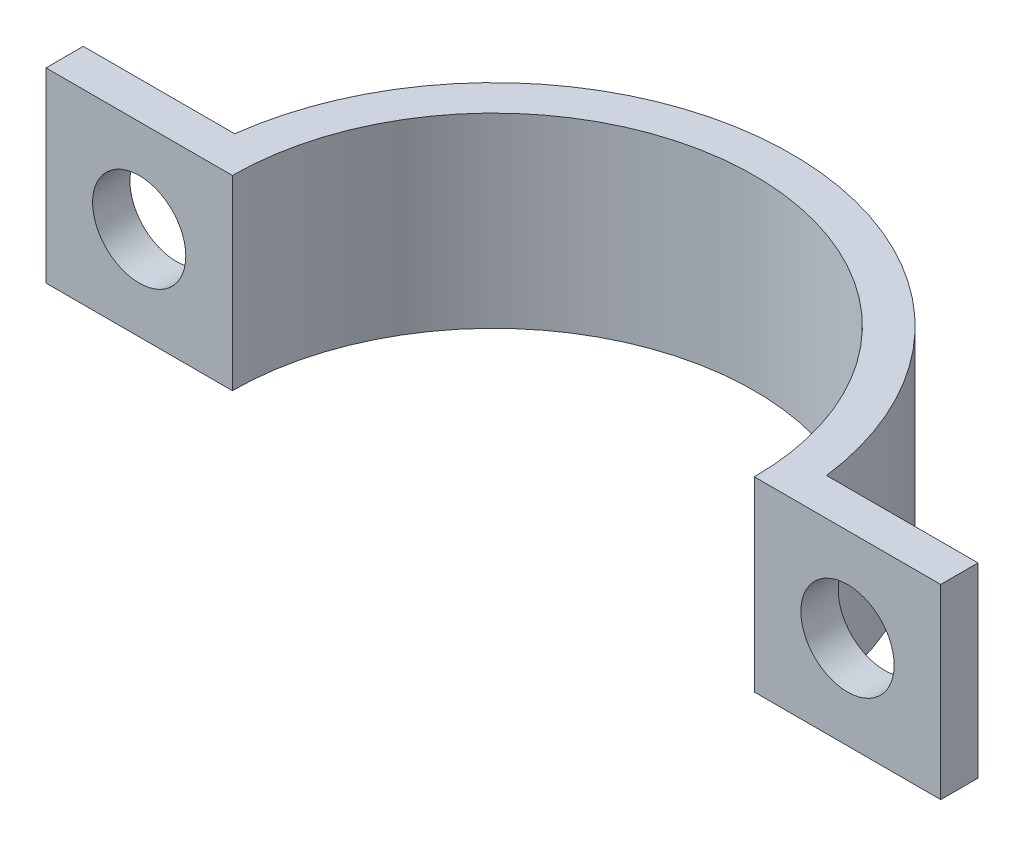
ISO-10303-21;
HEADER;
FILE_DESCRIPTION(('STEP AP214'),'2;1');
FILE_NAME('part.step','',(''),(''),'','','');
FILE_SCHEMA(('AUTOMOTIVE_DESIGN { 1 0 10303 214 1 1 1 1 }'));
ENDSEC;
DATA;
#1=APPLICATION_CONTEXT('core data for automotive mechanical design processes');
#2=APPLICATION_PROTOCOL_DEFINITION('international standard','automotive_design',2000,#1);
#3=PRODUCT_CONTEXT('',#1,'mechanical');
#4=PRODUCT('Part','Part','',(#3));
#5=PRODUCT_RELATED_PRODUCT_CATEGORY('part','',(#4));
#6=PRODUCT_DEFINITION_FORMATION('','',#4);
#7=PRODUCT_DEFINITION_CONTEXT('part definition',#1,'design');
#8=PRODUCT_DEFINITION('design','',#6,#7);
#9=PRODUCT_DEFINITION_SHAPE('','',#8);
#10=(LENGTH_UNIT() NAMED_UNIT(*) SI_UNIT(.MILLI.,.METRE.));
#11=(NAMED_UNIT(*) PLANE_ANGLE_UNIT() SI_UNIT($,.RADIAN.));
#12=(NAMED_UNIT(*) SI_UNIT($,.STERADIAN.) SOLID_ANGLE_UNIT());
#13=UNCERTAINTY_MEASURE_WITH_UNIT(LENGTH_MEASURE(1.E-05),#10,'distance_accuracy_value','');
#14=(GEOMETRIC_REPRESENTATION_CONTEXT(3) GLOBAL_UNCERTAINTY_ASSIGNED_CONTEXT((#13)) GLOBAL_UNIT_ASSIGNED_CONTEXT((#10,
#11,#12)) REPRESENTATION_CONTEXT('',''));
#15=CARTESIAN_POINT('',(0.,0.,0.));
#16=DIRECTION('',(0.,0.,1.));
#17=DIRECTION('',(1.,0.,0.));
#18=AXIS2_PLACEMENT_3D('',#15,#16,#17);
#19=CARTESIAN_POINT('',(14.,10.,0.));
#20=DIRECTION('',(0.,0.,-1.));
#21=DIRECTION('',(-1.,0.,0.));
#22=AXIS2_PLACEMENT_3D('',#19,#20,#21);
#23=PLANE('',#22);
#24=DIRECTION('',(1.,0.,0.));
#25=VECTOR('',#24,1.);
#26=CARTESIAN_POINT('',(14.,0.,0.));
#27=LINE('',#26,#25);
#28=CARTESIAN_POINT('',(14.,0.,0.));
#29=VERTEX_POINT('',#28);
#30=CARTESIAN_POINT('',(24.,0.,0.));
#31=VERTEX_POINT('',#30);
#32=EDGE_CURVE('E136',#29,#31,#27,.T.);
#33=ORIENTED_EDGE('',*,*,#32,.T.);
#34=DIRECTION('',(0.,-1.,0.));
#35=VECTOR('',#34,1.);
#36=CARTESIAN_POINT('',(24.,10.,0.));
#37=LINE('',#36,#35);
#38=CARTESIAN_POINT('',(24.,10.,0.));
#39=VERTEX_POINT('',#38);
#40=EDGE_CURVE('E45',#39,#31,#37,.T.);
#41=ORIENTED_EDGE('',*,*,#40,.F.);
#42=DIRECTION('',(1.,0.,0.));
#43=VECTOR('',#42,1.);
#44=CARTESIAN_POINT('',(14.,10.,0.));
#45=LINE('',#44,#43);
#46=CARTESIAN_POINT('',(14.,10.,0.));
#47=VERTEX_POINT('',#46);
#48=EDGE_CURVE('E96',#47,#39,#45,.T.);
#49=ORIENTED_EDGE('',*,*,#48,.F.);
#50=DIRECTION('',(0.,-1.,0.));
#51=VECTOR('',#50,1.);
#52=CARTESIAN_POINT('',(14.,10.,0.));
#53=LINE('',#52,#51);
#54=EDGE_CURVE('E11',#47,#29,#53,.T.);
#55=ORIENTED_EDGE('',*,*,#54,.T.);
#56=EDGE_LOOP('',(#33,#41,#49,#55));
#57=FACE_BOUND('',#56,.T.);
#58=CARTESIAN_POINT('',(19.,5.,0.));
#59=DIRECTION('',(0.,0.,-1.));
#60=DIRECTION('',(-1.,0.,0.));
#61=AXIS2_PLACEMENT_3D('',#58,#59,#60);
#62=CIRCLE('',#61,2.5);
#63=CARTESIAN_POINT('',(16.5,5.,0.));
#64=VERTEX_POINT('',#63);
#65=EDGE_CURVE('E188',#64,#64,#62,.T.);
#66=ORIENTED_EDGE('',*,*,#65,.T.);
#67=EDGE_LOOP('',(#66));
#68=FACE_BOUND('',#67,.T.);
#69=ADVANCED_FACE('F35',(#57,#68),#23,.F.);
#70=CARTESIAN_POINT('',(15.8745078663875,10.,-2.));
#71=DIRECTION('',(0.,0.,1.));
#72=DIRECTION('',(1.,0.,0.));
#73=AXIS2_PLACEMENT_3D('',#70,#71,#72);
#74=PLANE('',#73);
#75=DIRECTION('',(-1.,0.,0.));
#76=VECTOR('',#75,1.);
#77=CARTESIAN_POINT('',(15.8745078663875,0.,-2.));
#78=LINE('',#77,#76);
#79=CARTESIAN_POINT('',(24.,0.,-2.));
#80=VERTEX_POINT('',#79);
#81=CARTESIAN_POINT('',(15.8745078663875,0.,-2.));
#82=VERTEX_POINT('',#81);
#83=EDGE_CURVE('E141',#80,#82,#78,.T.);
#84=ORIENTED_EDGE('',*,*,#83,.T.);
#85=DIRECTION('',(0.,-1.,0.));
#86=VECTOR('',#85,1.);
#87=CARTESIAN_POINT('',(15.8745078663875,10.,-2.));
#88=LINE('',#87,#86);
#89=CARTESIAN_POINT('',(15.8745078663875,10.,-2.));
#90=VERTEX_POINT('',#89);
#91=EDGE_CURVE('E152',#90,#82,#88,.T.);
#92=ORIENTED_EDGE('',*,*,#91,.F.);
#93=DIRECTION('',(-1.,0.,0.));
#94=VECTOR('',#93,1.);
#95=CARTESIAN_POINT('',(15.8745078663875,10.,-2.));
#96=LINE('',#95,#94);
#97=CARTESIAN_POINT('',(24.,10.,-2.));
#98=VERTEX_POINT('',#97);
#99=EDGE_CURVE('E177',#98,#90,#96,.T.);
#100=ORIENTED_EDGE('',*,*,#99,.F.);
#101=DIRECTION('',(0.,-1.,0.));
#102=VECTOR('',#101,1.);
#103=CARTESIAN_POINT('',(24.,10.,-2.));
#104=LINE('',#103,#102);
#105=EDGE_CURVE('E155',#98,#80,#104,.T.);
#106=ORIENTED_EDGE('',*,*,#105,.T.);
#107=EDGE_LOOP('',(#84,#92,#100,#106));
#108=FACE_BOUND('',#107,.T.);
#109=CARTESIAN_POINT('',(19.,5.,-2.));
#110=DIRECTION('',(0.,0.,1.));
#111=DIRECTION('',(1.,0.,0.));
#112=AXIS2_PLACEMENT_3D('',#109,#110,#111);
#113=CIRCLE('',#112,2.5);
#114=CARTESIAN_POINT('',(21.5,5.,-2.));
#115=VERTEX_POINT('',#114);
#116=EDGE_CURVE('E39',#115,#115,#113,.F.);
#117=ORIENTED_EDGE('',*,*,#116,.F.);
#118=EDGE_LOOP('',(#117));
#119=FACE_BOUND('',#118,.T.);
#120=ADVANCED_FACE('F172',(#108,#119),#74,.F.);
#121=CARTESIAN_POINT('',(0.,10.,0.));
#122=DIRECTION('',(0.,-1.,0.));
#123=DIRECTION('',(0.,0.,-1.));
#124=AXIS2_PLACEMENT_3D('',#121,#122,#123);
#125=CYLINDRICAL_SURFACE('',#124,14.);
#126=CARTESIAN_POINT('',(0.,0.,0.));
#127=DIRECTION('',(0.,-1.,0.));
#128=DIRECTION('',(0.,0.,-1.));
#129=AXIS2_PLACEMENT_3D('',#126,#127,#128);
#130=CIRCLE('',#129,14.);
#131=CARTESIAN_POINT('',(-14.,0.,0.));
#132=VERTEX_POINT('',#131);
#133=EDGE_CURVE('E133',#132,#29,#130,.T.);
#134=ORIENTED_EDGE('',*,*,#133,.T.);
#135=ORIENTED_EDGE('',*,*,#54,.F.);
#136=CARTESIAN_POINT('',(0.,10.,0.));
#137=DIRECTION('',(0.,-1.,0.));
#138=DIRECTION('',(0.,0.,-1.));
#139=AXIS2_PLACEMENT_3D('',#136,#137,#138);
#140=CIRCLE('',#139,14.);
#141=CARTESIAN_POINT('',(-14.,10.,0.));
#142=VERTEX_POINT('',#141);
#143=EDGE_CURVE('E148',#142,#47,#140,.T.);
#144=ORIENTED_EDGE('',*,*,#143,.F.);
#145=DIRECTION('',(0.,-1.,0.));
#146=VECTOR('',#145,1.);
#147=CARTESIAN_POINT('',(-14.,10.,0.));
#148=LINE('',#147,#146);
#149=EDGE_CURVE('E129',#142,#132,#148,.T.);
#150=ORIENTED_EDGE('',*,*,#149,.T.);
#151=EDGE_LOOP('',(#134,#135,#144,#150));
#152=FACE_BOUND('',#151,.T.);
#153=ADVANCED_FACE('F37',(#152),#125,.F.);
#154=CARTESIAN_POINT('',(24.,10.,-2.));
#155=DIRECTION('',(-1.,0.,0.));
#156=DIRECTION('',(0.,0.,1.));
#157=AXIS2_PLACEMENT_3D('',#154,#155,#156);
#158=PLANE('',#157);
#159=DIRECTION('',(0.,0.,-1.));
#160=VECTOR('',#159,1.);
#161=CARTESIAN_POINT('',(24.,0.,-2.));
#162=LINE('',#161,#160);
#163=EDGE_CURVE('E139',#31,#80,#162,.T.);
#164=ORIENTED_EDGE('',*,*,#163,.T.);
#165=ORIENTED_EDGE('',*,*,#105,.F.);
#166=DIRECTION('',(0.,0.,-1.));
#167=VECTOR('',#166,1.);
#168=CARTESIAN_POINT('',(24.,10.,-2.));
#169=LINE('',#168,#167);
#170=EDGE_CURVE('E164',#39,#98,#169,.T.);
#171=ORIENTED_EDGE('',*,*,#170,.F.);
#172=ORIENTED_EDGE('',*,*,#40,.T.);
#173=EDGE_LOOP('',(#164,#165,#171,#172));
#174=FACE_BOUND('',#173,.T.);
#175=ADVANCED_FACE('F162',(#174),#158,.F.);
#176=CARTESIAN_POINT('',(0.,10.,0.));
#177=DIRECTION('',(0.,-1.,0.));
#178=DIRECTION('',(0.,0.,-1.));
#179=AXIS2_PLACEMENT_3D('',#176,#177,#178);
#180=CYLINDRICAL_SURFACE('',#179,16.);
#181=CARTESIAN_POINT('',(0.,0.,0.));
#182=DIRECTION('',(0.,1.,0.));
#183=DIRECTION('',(0.,0.,-1.));
#184=AXIS2_PLACEMENT_3D('',#181,#182,#183);
#185=CIRCLE('',#184,16.);
#186=CARTESIAN_POINT('',(-15.8745078663875,0.,-2.));
#187=VERTEX_POINT('',#186);
#188=EDGE_CURVE('E143',#82,#187,#185,.T.);
#189=ORIENTED_EDGE('',*,*,#188,.T.);
#190=DIRECTION('',(0.,-1.,0.));
#191=VECTOR('',#190,1.);
#192=CARTESIAN_POINT('',(-15.8745078663875,10.,-2.));
#193=LINE('',#192,#191);
#194=CARTESIAN_POINT('',(-15.8745078663875,10.,-2.));
#195=VERTEX_POINT('',#194);
#196=EDGE_CURVE('E124',#195,#187,#193,.T.);
#197=ORIENTED_EDGE('',*,*,#196,.F.);
#198=CARTESIAN_POINT('',(0.,10.,0.));
#199=DIRECTION('',(0.,1.,0.));
#200=DIRECTION('',(0.,0.,-1.));
#201=AXIS2_PLACEMENT_3D('',#198,#199,#200);
#202=CIRCLE('',#201,16.);
#203=EDGE_CURVE('E115',#90,#195,#202,.T.);
#204=ORIENTED_EDGE('',*,*,#203,.F.);
#205=ORIENTED_EDGE('',*,*,#91,.T.);
#206=EDGE_LOOP('',(#189,#197,#204,#205));
#207=FACE_BOUND('',#206,.T.);
#208=ADVANCED_FACE('F176',(#207),#180,.T.);
#209=CARTESIAN_POINT('',(-15.8745078663875,10.,-2.));
#210=DIRECTION('',(0.,0.,1.));
#211=DIRECTION('',(1.,0.,0.));
#212=AXIS2_PLACEMENT_3D('',#209,#210,#211);
#213=PLANE('',#212);
#214=CARTESIAN_POINT('',(-19.,5.,-2.));
#215=DIRECTION('',(0.,0.,1.));
#216=DIRECTION('',(1.,0.,0.));
#217=AXIS2_PLACEMENT_3D('',#214,#215,#216);
#218=CIRCLE('',#217,2.5);
#219=CARTESIAN_POINT('',(-16.5,5.,-2.));
#220=VERTEX_POINT('',#219);
#221=EDGE_CURVE('E137',#220,#220,#218,.T.);
#222=ORIENTED_EDGE('',*,*,#221,.T.);
#223=EDGE_LOOP('',(#222));
#224=FACE_BOUND('',#223,.T.);
#225=DIRECTION('',(-1.,0.,0.));
#226=VECTOR('',#225,1.);
#227=CARTESIAN_POINT('',(-15.8745078663875,0.,-2.));
#228=LINE('',#227,#226);
#229=CARTESIAN_POINT('',(-24.,0.,-2.));
#230=VERTEX_POINT('',#229);
#231=EDGE_CURVE('E123',#187,#230,#228,.T.);
#232=ORIENTED_EDGE('',*,*,#231,.T.);
#233=DIRECTION('',(0.,-1.,0.));
#234=VECTOR('',#233,1.);
#235=CARTESIAN_POINT('',(-24.,10.,-2.));
#236=LINE('',#235,#234);
#237=CARTESIAN_POINT('',(-24.,10.,-2.));
#238=VERTEX_POINT('',#237);
#239=EDGE_CURVE('E120',#238,#230,#236,.T.);
#240=ORIENTED_EDGE('',*,*,#239,.F.);
#241=DIRECTION('',(-1.,0.,0.));
#242=VECTOR('',#241,1.);
#243=CARTESIAN_POINT('',(-15.8745078663875,10.,-2.));
#244=LINE('',#243,#242);
#245=EDGE_CURVE('E109',#195,#238,#244,.T.);
#246=ORIENTED_EDGE('',*,*,#245,.F.);
#247=ORIENTED_EDGE('',*,*,#196,.T.);
#248=EDGE_LOOP('',(#232,#240,#246,#247));
#249=FACE_BOUND('',#248,.T.);
#250=ADVANCED_FACE('F121',(#224,#249),#213,.F.);
#251=CARTESIAN_POINT('',(-24.,10.,-2.));
#252=DIRECTION('',(1.,0.,0.));
#253=DIRECTION('',(0.,0.,-1.));
#254=AXIS2_PLACEMENT_3D('',#251,#252,#253);
#255=PLANE('',#254);
#256=DIRECTION('',(0.,0.,1.));
#257=VECTOR('',#256,1.);
#258=CARTESIAN_POINT('',(-24.,0.,-2.));
#259=LINE('',#258,#257);
#260=CARTESIAN_POINT('',(-24.,0.,0.));
#261=VERTEX_POINT('',#260);
#262=EDGE_CURVE('E82',#230,#261,#259,.T.);
#263=ORIENTED_EDGE('',*,*,#262,.T.);
#264=DIRECTION('',(0.,-1.,0.));
#265=VECTOR('',#264,1.);
#266=CARTESIAN_POINT('',(-24.,10.,0.));
#267=LINE('',#266,#265);
#268=CARTESIAN_POINT('',(-24.,10.,0.));
#269=VERTEX_POINT('',#268);
#270=EDGE_CURVE('E125',#269,#261,#267,.T.);
#271=ORIENTED_EDGE('',*,*,#270,.F.);
#272=DIRECTION('',(0.,0.,1.));
#273=VECTOR('',#272,1.);
#274=CARTESIAN_POINT('',(-24.,10.,-2.));
#275=LINE('',#274,#273);
#276=EDGE_CURVE('E113',#238,#269,#275,.T.);
#277=ORIENTED_EDGE('',*,*,#276,.F.);
#278=ORIENTED_EDGE('',*,*,#239,.T.);
#279=EDGE_LOOP('',(#263,#271,#277,#278));
#280=FACE_BOUND('',#279,.T.);
#281=ADVANCED_FACE('F127',(#280),#255,.F.);
#282=CARTESIAN_POINT('',(-14.,10.,0.));
#283=DIRECTION('',(0.,0.,-1.));
#284=DIRECTION('',(-1.,0.,0.));
#285=AXIS2_PLACEMENT_3D('',#282,#283,#284);
#286=PLANE('',#285);
#287=CARTESIAN_POINT('',(-19.,5.,0.));
#288=DIRECTION('',(0.,0.,1.));
#289=DIRECTION('',(1.,0.,0.));
#290=AXIS2_PLACEMENT_3D('',#287,#288,#289);
#291=CIRCLE('',#290,2.5);
#292=CARTESIAN_POINT('',(-16.5,5.,0.));
#293=VERTEX_POINT('',#292);
#294=EDGE_CURVE('E185',#293,#293,#291,.T.);
#295=ORIENTED_EDGE('',*,*,#294,.F.);
#296=EDGE_LOOP('',(#295));
#297=FACE_BOUND('',#296,.T.);
#298=DIRECTION('',(1.,0.,0.));
#299=VECTOR('',#298,1.);
#300=CARTESIAN_POINT('',(-14.,0.,0.));
#301=LINE('',#300,#299);
#302=EDGE_CURVE('E88',#261,#132,#301,.T.);
#303=ORIENTED_EDGE('',*,*,#302,.T.);
#304=ORIENTED_EDGE('',*,*,#149,.F.);
#305=DIRECTION('',(1.,0.,0.));
#306=VECTOR('',#305,1.);
#307=CARTESIAN_POINT('',(-14.,10.,0.));
#308=LINE('',#307,#306);
#309=EDGE_CURVE('E53',#269,#142,#308,.T.);
#310=ORIENTED_EDGE('',*,*,#309,.F.);
#311=ORIENTED_EDGE('',*,*,#270,.T.);
#312=EDGE_LOOP('',(#303,#304,#310,#311));
#313=FACE_BOUND('',#312,.T.);
#314=ADVANCED_FACE('F217',(#297,#313),#286,.F.);
#315=CARTESIAN_POINT('',(0.,10.,0.));
#316=DIRECTION('',(0.,-1.,0.));
#317=DIRECTION('',(0.,0.,-1.));
#318=AXIS2_PLACEMENT_3D('',#315,#316,#317);
#319=PLANE('',#318);
#320=ORIENTED_EDGE('',*,*,#143,.T.);
#321=ORIENTED_EDGE('',*,*,#48,.T.);
#322=ORIENTED_EDGE('',*,*,#170,.T.);
#323=ORIENTED_EDGE('',*,*,#99,.T.);
#324=ORIENTED_EDGE('',*,*,#203,.T.);
#325=ORIENTED_EDGE('',*,*,#245,.T.);
#326=ORIENTED_EDGE('',*,*,#276,.T.);
#327=ORIENTED_EDGE('',*,*,#309,.T.);
#328=EDGE_LOOP('',(#320,#321,#322,#323,#324,#325,#326,#327));
#329=FACE_BOUND('',#328,.T.);
#330=ADVANCED_FACE('F111',(#329),#319,.F.);
#331=CARTESIAN_POINT('',(0.,0.,0.));
#332=DIRECTION('',(0.,-1.,0.));
#333=DIRECTION('',(0.,0.,-1.));
#334=AXIS2_PLACEMENT_3D('',#331,#332,#333);
#335=PLANE('',#334);
#336=ORIENTED_EDGE('',*,*,#133,.F.);
#337=ORIENTED_EDGE('',*,*,#302,.F.);
#338=ORIENTED_EDGE('',*,*,#262,.F.);
#339=ORIENTED_EDGE('',*,*,#231,.F.);
#340=ORIENTED_EDGE('',*,*,#188,.F.);
#341=ORIENTED_EDGE('',*,*,#83,.F.);
#342=ORIENTED_EDGE('',*,*,#163,.F.);
#343=ORIENTED_EDGE('',*,*,#32,.F.);
#344=EDGE_LOOP('',(#336,#337,#338,#339,#340,#341,#342,#343));
#345=FACE_BOUND('',#344,.T.);
#346=ADVANCED_FACE('F168',(#345),#335,.T.);
#347=CARTESIAN_POINT('',(-19.,5.,-16.));
#348=DIRECTION('',(0.,0.,1.));
#349=DIRECTION('',(1.,0.,0.));
#350=AXIS2_PLACEMENT_3D('',#347,#348,#349);
#351=CYLINDRICAL_SURFACE('',#350,2.5);
#352=ORIENTED_EDGE('',*,*,#294,.T.);
#353=EDGE_LOOP('',(#352));
#354=FACE_BOUND('',#353,.T.);
#355=ORIENTED_EDGE('',*,*,#221,.F.);
#356=EDGE_LOOP('',(#355));
#357=FACE_BOUND('',#356,.T.);
#358=ADVANCED_FACE('F225',(#354,#357),#351,.F.);
#359=CARTESIAN_POINT('',(19.,5.,-16.));
#360=DIRECTION('',(0.,0.,1.));
#361=DIRECTION('',(1.,0.,0.));
#362=AXIS2_PLACEMENT_3D('',#359,#360,#361);
#363=CYLINDRICAL_SURFACE('',#362,2.5);
#364=ORIENTED_EDGE('',*,*,#65,.F.);
#365=EDGE_LOOP('',(#364));
#366=FACE_BOUND('',#365,.T.);
#367=ORIENTED_EDGE('',*,*,#116,.T.);
#368=EDGE_LOOP('',(#367));
#369=FACE_BOUND('',#368,.T.);
#370=ADVANCED_FACE('F195',(#366,#369),#363,.F.);
#371=CLOSED_SHELL('',(#69,#120,#153,#175,#208,#250,#281,#314,#330,#346,#358,#370));
#372=MANIFOLD_SOLID_BREP('B2',#371);
#373=ADVANCED_BREP_SHAPE_REPRESENTATION('',(#18,#372),#14);
#374=SHAPE_DEFINITION_REPRESENTATION(#9,#373);
ENDSEC;
END-ISO-10303-21;
